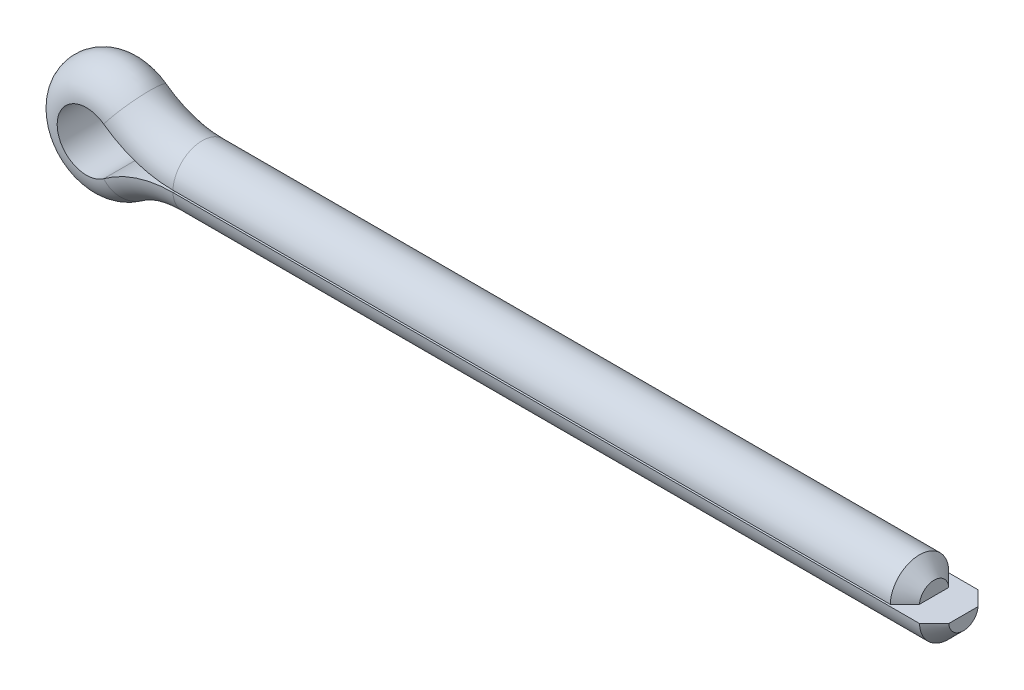
ISO-10303-21;
HEADER;
FILE_DESCRIPTION(('STEP AP214'),'2;1');
FILE_NAME('part.step','',(''),(''),'','','');
FILE_SCHEMA(('AUTOMOTIVE_DESIGN { 1 0 10303 214 1 1 1 1 }'));
ENDSEC;
DATA;
#1=APPLICATION_CONTEXT('core data for automotive mechanical design processes');
#2=APPLICATION_PROTOCOL_DEFINITION('international standard','automotive_design',2000,#1);
#3=PRODUCT_CONTEXT('',#1,'mechanical');
#4=PRODUCT('Part','Part','',(#3));
#5=PRODUCT_RELATED_PRODUCT_CATEGORY('part','',(#4));
#6=PRODUCT_DEFINITION_FORMATION('','',#4);
#7=PRODUCT_DEFINITION_CONTEXT('part definition',#1,'design');
#8=PRODUCT_DEFINITION('design','',#6,#7);
#9=PRODUCT_DEFINITION_SHAPE('','',#8);
#10=(LENGTH_UNIT() NAMED_UNIT(*) SI_UNIT(.MILLI.,.METRE.));
#11=(NAMED_UNIT(*) PLANE_ANGLE_UNIT() SI_UNIT($,.RADIAN.));
#12=(NAMED_UNIT(*) SI_UNIT($,.STERADIAN.) SOLID_ANGLE_UNIT());
#13=UNCERTAINTY_MEASURE_WITH_UNIT(LENGTH_MEASURE(1.E-05),#10,'distance_accuracy_value','');
#14=(GEOMETRIC_REPRESENTATION_CONTEXT(3) GLOBAL_UNCERTAINTY_ASSIGNED_CONTEXT((#13)) GLOBAL_UNIT_ASSIGNED_CONTEXT((#10,
#11,#12)) REPRESENTATION_CONTEXT('',''));
#15=CARTESIAN_POINT('',(0.,0.,0.));
#16=DIRECTION('',(0.,0.,1.));
#17=DIRECTION('',(1.,0.,0.));
#18=AXIS2_PLACEMENT_3D('',#15,#16,#17);
#19=CARTESIAN_POINT('',(0.761999999999999,0.,0.));
#20=DIRECTION('',(-1.,0.,0.));
#21=DIRECTION('',(0.,0.,-1.));
#22=AXIS2_PLACEMENT_3D('',#19,#20,#21);
#23=PLANE('',#22);
#24=DIRECTION('',(0.,0.,-1.));
#25=VECTOR('',#24,1.);
#26=CARTESIAN_POINT('',(0.761999999999999,-0.0254,0.761576549008699));
#27=LINE('',#26,#25);
#28=CARTESIAN_POINT('',(0.761999999999999,-0.0254,0.380152390496232));
#29=VERTEX_POINT('',#28);
#30=CARTESIAN_POINT('',(0.761999999999999,-0.0253999999999999,-0.380152390496232));
#31=VERTEX_POINT('',#30);
#32=EDGE_CURVE('E149',#29,#31,#27,.T.);
#33=ORIENTED_EDGE('',*,*,#32,.F.);
#34=CARTESIAN_POINT('',(0.761999999999999,0.,0.));
#35=DIRECTION('',(-1.,0.,0.));
#36=DIRECTION('',(0.,-1.,0.));
#37=AXIS2_PLACEMENT_3D('',#34,#35,#36);
#38=CIRCLE('',#37,0.380999999999999);
#39=EDGE_CURVE('E284',#29,#31,#38,.F.);
#40=ORIENTED_EDGE('',*,*,#39,.T.);
#41=EDGE_LOOP('',(#33,#40));
#42=FACE_BOUND('',#41,.T.);
#43=ADVANCED_FACE('F69',(#42),#23,.F.);
#44=CARTESIAN_POINT('',(0.,0.,0.));
#45=DIRECTION('',(1.,0.,0.));
#46=DIRECTION('',(0.,0.,-1.));
#47=AXIS2_PLACEMENT_3D('',#44,#45,#46);
#48=PLANE('',#47);
#49=DIRECTION('',(0.,0.,-1.));
#50=VECTOR('',#49,1.);
#51=CARTESIAN_POINT('',(0.,0.0254,0.761576549008699));
#52=LINE('',#51,#50);
#53=CARTESIAN_POINT('',(0.,0.0254,0.380152390496232));
#54=VERTEX_POINT('',#53);
#55=CARTESIAN_POINT('',(0.,0.0253999999999999,-0.380152390496232));
#56=VERTEX_POINT('',#55);
#57=EDGE_CURVE('E209',#54,#56,#52,.T.);
#58=ORIENTED_EDGE('',*,*,#57,.T.);
#59=CARTESIAN_POINT('',(0.,0.,0.));
#60=DIRECTION('',(1.,0.,0.));
#61=DIRECTION('',(0.,0.,-1.));
#62=AXIS2_PLACEMENT_3D('',#59,#60,#61);
#63=CIRCLE('',#62,0.380999999999999);
#64=EDGE_CURVE('E280',#56,#54,#63,.T.);
#65=ORIENTED_EDGE('',*,*,#64,.T.);
#66=EDGE_LOOP('',(#58,#65));
#67=FACE_BOUND('',#66,.T.);
#68=ADVANCED_FACE('F255',(#67),#48,.T.);
#69=CARTESIAN_POINT('',(0.761999999999999,0.,0.));
#70=DIRECTION('',(-1.,0.,0.));
#71=DIRECTION('',(0.,-1.,0.));
#72=AXIS2_PLACEMENT_3D('',#69,#70,#71);
#73=CYLINDRICAL_SURFACE('',#72,0.761999999999999);
#74=DIRECTION('',(-1.,0.,0.));
#75=VECTOR('',#74,1.);
#76=CARTESIAN_POINT('',(0.761999999999999,-0.0253999999999999,-0.761576549008699));
#77=LINE('',#76,#75);
#78=CARTESIAN_POINT('',(0.381000000000002,-0.0253999999999998,-0.761576549008699));
#79=VERTEX_POINT('',#78);
#80=CARTESIAN_POINT('',(-19.05,-0.0253999999999973,-0.761576549008699));
#81=VERTEX_POINT('',#80);
#82=EDGE_CURVE('E133',#79,#81,#77,.T.);
#83=ORIENTED_EDGE('',*,*,#82,.F.);
#84=CARTESIAN_POINT('',(0.381000000000002,0.,0.));
#85=DIRECTION('',(-1.,0.,0.));
#86=DIRECTION('',(0.,-1.,0.));
#87=AXIS2_PLACEMENT_3D('',#84,#85,#86);
#88=CIRCLE('',#87,0.761999999999999);
#89=CARTESIAN_POINT('',(0.381000000000002,-0.0254,0.761576549008699));
#90=VERTEX_POINT('',#89);
#91=EDGE_CURVE('E227',#79,#90,#88,.T.);
#92=ORIENTED_EDGE('',*,*,#91,.T.);
#93=DIRECTION('',(-1.,0.,0.));
#94=VECTOR('',#93,1.);
#95=CARTESIAN_POINT('',(0.761999999999999,-0.0254,0.761576549008699));
#96=LINE('',#95,#94);
#97=CARTESIAN_POINT('',(-19.05,-0.0253999999999975,0.761576549008699));
#98=VERTEX_POINT('',#97);
#99=EDGE_CURVE('E167',#90,#98,#96,.T.);
#100=ORIENTED_EDGE('',*,*,#99,.T.);
#101=CARTESIAN_POINT('',(-19.05,0.,0.));
#102=DIRECTION('',(-1.,0.,0.));
#103=DIRECTION('',(0.,0.,-1.));
#104=AXIS2_PLACEMENT_3D('',#101,#102,#103);
#105=CIRCLE('',#104,0.761999999999999);
#106=EDGE_CURVE('E148',#81,#98,#105,.T.);
#107=ORIENTED_EDGE('',*,*,#106,.F.);
#108=EDGE_LOOP('',(#83,#92,#100,#107));
#109=FACE_BOUND('',#108,.T.);
#110=ADVANCED_FACE('F169',(#109),#73,.T.);
#111=CARTESIAN_POINT('',(0.761999999999999,-0.0254,0.761576549008699));
#112=DIRECTION('',(0.,1.,0.));
#113=DIRECTION('',(-1.,0.,0.));
#114=AXIS2_PLACEMENT_3D('',#111,#112,#113);
#115=PLANE('',#114);
#116=ORIENTED_EDGE('',*,*,#99,.F.);
#117=CARTESIAN_POINT('',(0.381000000000002,-0.0254,0.761576549008699));
#118=CARTESIAN_POINT('',(0.444523602983847,-0.0254,0.698029434118925));
#119=CARTESIAN_POINT('',(0.508035404111098,-0.0254,0.634470530496681));
#120=CARTESIAN_POINT('',(0.63503540411164,-0.0254,0.507329144326401));
#121=CARTESIAN_POINT('',(0.698523602984388,-0.0254,0.443746661777822));
#122=CARTESIAN_POINT('',(0.761999999999999,-0.0254,0.380152390496232));
#123=B_SPLINE_CURVE_WITH_KNOTS('',3,(#117,#118,#119,#120,#121,#122),.UNSPECIFIED.,.F.,.F.,(4,2,
4),(0.,0.269557689574612,0.539115385343649),.UNSPECIFIED.);
#124=EDGE_CURVE('E237',#90,#29,#123,.T.);
#125=ORIENTED_EDGE('',*,*,#124,.T.);
#126=ORIENTED_EDGE('',*,*,#32,.T.);
#127=CARTESIAN_POINT('',(0.761999999999999,-0.0253999999999999,-0.380152390496232));
#128=CARTESIAN_POINT('',(0.656880354086052,-0.0253999999999999,-0.485453197874022));
#129=CARTESIAN_POINT('',(0.55173416036815,-0.0253999999999998,-0.590727481670878));
#130=CARTESIAN_POINT('',(0.424708758686162,-0.0253999999999998,-0.717843489336977));
#131=CARTESIAN_POINT('',(0.402854952404066,-0.0253999999999998,-0.739710591710943));
#132=CARTESIAN_POINT('',(0.381000000000003,-0.0253999999999998,-0.7615765490087));
#133=B_SPLINE_CURVE_WITH_KNOTS('',3,(#127,#128,#129,#130,#131,#132),.UNSPECIFIED.,.F.,.F.,(4,2,
4),(0.,0.446369322356199,0.539115379616012),.UNSPECIFIED.);
#134=EDGE_CURVE('E142',#31,#79,#133,.T.);
#135=ORIENTED_EDGE('',*,*,#134,.T.);
#136=ORIENTED_EDGE('',*,*,#82,.T.);
#137=DIRECTION('',(0.,0.,-1.));
#138=VECTOR('',#137,1.);
#139=CARTESIAN_POINT('',(-19.05,-0.0253999999999975,0.761576549008699));
#140=LINE('',#139,#138);
#141=EDGE_CURVE('E138',#98,#81,#140,.T.);
#142=ORIENTED_EDGE('',*,*,#141,.F.);
#143=EDGE_LOOP('',(#116,#125,#126,#135,#136,#142));
#144=FACE_BOUND('',#143,.T.);
#145=ADVANCED_FACE('F136',(#144),#115,.T.);
#146=CARTESIAN_POINT('',(-19.05,-3.0734,0.));
#147=DIRECTION('',(0.,0.,1.));
#148=DIRECTION('',(1.,0.,0.));
#149=AXIS2_PLACEMENT_3D('',#146,#147,#148);
#150=TOROIDAL_SURFACE('',#149,3.0734,0.761999999999999);
#151=CARTESIAN_POINT('',(-19.05,-3.0734,0.761576549008699));
#152=DIRECTION('',(0.,0.,1.));
#153=DIRECTION('',(0.,1.,0.));
#154=AXIS2_PLACEMENT_3D('',#151,#152,#153);
#155=CIRCLE('',#154,3.048);
#156=CARTESIAN_POINT('',(-20.8513883428067,-0.614680000000001,0.761576549008699));
#157=VERTEX_POINT('',#156);
#158=EDGE_CURVE('E165',#98,#157,#155,.T.);
#159=ORIENTED_EDGE('',*,*,#158,.T.);
#160=CARTESIAN_POINT('',(-20.8663999123301,-0.594190666666668,0.));
#161=DIRECTION('',(-0.806666666666665,-0.591006674149194,0.));
#162=DIRECTION('',(0.,0.,-1.));
#163=AXIS2_PLACEMENT_3D('',#160,#161,#162);
#164=CIRCLE('',#163,0.761999999999999);
#165=CARTESIAN_POINT('',(-20.8513883428067,-0.614680000000001,-0.761576549008699));
#166=VERTEX_POINT('',#165);
#167=EDGE_CURVE('E158',#166,#157,#164,.T.);
#168=ORIENTED_EDGE('',*,*,#167,.F.);
#169=CARTESIAN_POINT('',(-19.05,-3.0734,-0.761576549008699));
#170=DIRECTION('',(0.,0.,1.));
#171=DIRECTION('',(0.,1.,0.));
#172=AXIS2_PLACEMENT_3D('',#169,#170,#171);
#173=CIRCLE('',#172,3.048);
#174=EDGE_CURVE('E154',#81,#166,#173,.T.);
#175=ORIENTED_EDGE('',*,*,#174,.F.);
#176=ORIENTED_EDGE('',*,*,#106,.T.);
#177=EDGE_LOOP('',(#159,#168,#175,#176));
#178=FACE_BOUND('',#177,.T.);
#179=ADVANCED_FACE('F156',(#178),#150,.T.);
#180=CARTESIAN_POINT('',(-19.05,-3.0734,0.));
#181=DIRECTION('',(0.,0.,1.));
#182=DIRECTION('',(1.,0.,0.));
#183=AXIS2_PLACEMENT_3D('',#180,#181,#182);
#184=CYLINDRICAL_SURFACE('',#183,3.048);
#185=DIRECTION('',(0.,0.,-1.));
#186=VECTOR('',#185,1.);
#187=CARTESIAN_POINT('',(-20.8513883428067,-0.614680000000001,0.761576549008699));
#188=LINE('',#187,#186);
#189=EDGE_CURVE('E178',#157,#166,#188,.T.);
#190=ORIENTED_EDGE('',*,*,#189,.F.);
#191=ORIENTED_EDGE('',*,*,#158,.F.);
#192=ORIENTED_EDGE('',*,*,#141,.T.);
#193=ORIENTED_EDGE('',*,*,#174,.T.);
#194=EDGE_LOOP('',(#190,#191,#192,#193));
#195=FACE_BOUND('',#194,.T.);
#196=ADVANCED_FACE('F164',(#195),#184,.T.);
#197=CARTESIAN_POINT('',(-21.3017354285084,0.,0.));
#198=DIRECTION('',(0.,0.,-1.));
#199=DIRECTION('',(-1.,0.,0.));
#200=AXIS2_PLACEMENT_3D('',#197,#198,#199);
#201=DEGENERATE_TOROIDAL_SURFACE('',#200,0.736600000000001,0.761999999999999,.T.);
#202=CARTESIAN_POINT('',(-21.3017354285084,0.,0.761576549008699));
#203=DIRECTION('',(0.,0.,-1.));
#204=DIRECTION('',(0.591006674149193,-0.806666666666666,0.));
#205=AXIS2_PLACEMENT_3D('',#202,#203,#204);
#206=CIRCLE('',#205,0.762000000000001);
#207=CARTESIAN_POINT('',(-20.8513883428067,0.61468,0.761576549008699));
#208=VERTEX_POINT('',#207);
#209=EDGE_CURVE('E184',#157,#208,#206,.T.);
#210=ORIENTED_EDGE('',*,*,#209,.T.);
#211=CARTESIAN_POINT('',(-20.8663999123301,0.594190666666666,0.));
#212=DIRECTION('',(0.806666666666666,-0.591006674149193,0.));
#213=DIRECTION('',(0.,0.,-1.));
#214=AXIS2_PLACEMENT_3D('',#211,#212,#213);
#215=CIRCLE('',#214,0.761999999999999);
#216=CARTESIAN_POINT('',(-20.8513883428067,0.61468,-0.761576549008699));
#217=VERTEX_POINT('',#216);
#218=EDGE_CURVE('E180',#217,#208,#215,.T.);
#219=ORIENTED_EDGE('',*,*,#218,.F.);
#220=CARTESIAN_POINT('',(-21.3017354285084,0.,-0.761576549008699));
#221=DIRECTION('',(0.,0.,-1.));
#222=DIRECTION('',(0.591006674149193,-0.806666666666666,0.));
#223=AXIS2_PLACEMENT_3D('',#220,#221,#222);
#224=CIRCLE('',#223,0.762000000000001);
#225=EDGE_CURVE('E185',#166,#217,#224,.T.);
#226=ORIENTED_EDGE('',*,*,#225,.F.);
#227=ORIENTED_EDGE('',*,*,#167,.T.);
#228=EDGE_LOOP('',(#210,#219,#226,#227));
#229=FACE_BOUND('',#228,.T.);
#230=ADVANCED_FACE('F348',(#229),#201,.T.);
#231=CARTESIAN_POINT('',(-21.3017354285084,0.,0.));
#232=DIRECTION('',(0.,0.,-1.));
#233=DIRECTION('',(-1.,0.,0.));
#234=AXIS2_PLACEMENT_3D('',#231,#232,#233);
#235=CYLINDRICAL_SURFACE('',#234,0.762000000000001);
#236=DIRECTION('',(0.,0.,-1.));
#237=VECTOR('',#236,1.);
#238=CARTESIAN_POINT('',(-20.8513883428067,0.61468,0.761576549008699));
#239=LINE('',#238,#237);
#240=EDGE_CURVE('E189',#208,#217,#239,.T.);
#241=ORIENTED_EDGE('',*,*,#240,.F.);
#242=ORIENTED_EDGE('',*,*,#209,.F.);
#243=ORIENTED_EDGE('',*,*,#189,.T.);
#244=ORIENTED_EDGE('',*,*,#225,.T.);
#245=EDGE_LOOP('',(#241,#242,#243,#244));
#246=FACE_BOUND('',#245,.T.);
#247=ADVANCED_FACE('F340',(#246),#235,.F.);
#248=CARTESIAN_POINT('',(-19.05,3.0734,0.));
#249=DIRECTION('',(0.,0.,1.));
#250=DIRECTION('',(1.,0.,0.));
#251=AXIS2_PLACEMENT_3D('',#248,#249,#250);
#252=TOROIDAL_SURFACE('',#251,3.07339999999999,0.761999999999999);
#253=CARTESIAN_POINT('',(-19.05,3.0734,0.761576549008699));
#254=DIRECTION('',(0.,0.,1.));
#255=DIRECTION('',(-0.59100667414919,-0.806666666666668,0.));
#256=AXIS2_PLACEMENT_3D('',#253,#254,#255);
#257=CIRCLE('',#256,3.04799999999999);
#258=CARTESIAN_POINT('',(-19.05,0.0254000000000035,0.761576549008699));
#259=VERTEX_POINT('',#258);
#260=EDGE_CURVE('E197',#208,#259,#257,.T.);
#261=ORIENTED_EDGE('',*,*,#260,.T.);
#262=CARTESIAN_POINT('',(-19.05,0.,0.));
#263=DIRECTION('',(1.,0.,0.));
#264=DIRECTION('',(0.,0.,-1.));
#265=AXIS2_PLACEMENT_3D('',#262,#263,#264);
#266=CIRCLE('',#265,0.761999999999999);
#267=CARTESIAN_POINT('',(-19.05,0.0254000000000035,-0.761576549008699));
#268=VERTEX_POINT('',#267);
#269=EDGE_CURVE('E193',#268,#259,#266,.T.);
#270=ORIENTED_EDGE('',*,*,#269,.F.);
#271=CARTESIAN_POINT('',(-19.05,3.0734,-0.761576549008699));
#272=DIRECTION('',(0.,0.,1.));
#273=DIRECTION('',(-0.59100667414919,-0.806666666666668,0.));
#274=AXIS2_PLACEMENT_3D('',#271,#272,#273);
#275=CIRCLE('',#274,3.04799999999999);
#276=EDGE_CURVE('E198',#217,#268,#275,.T.);
#277=ORIENTED_EDGE('',*,*,#276,.F.);
#278=ORIENTED_EDGE('',*,*,#218,.T.);
#279=EDGE_LOOP('',(#261,#270,#277,#278));
#280=FACE_BOUND('',#279,.T.);
#281=ADVANCED_FACE('F333',(#280),#252,.T.);
#282=CARTESIAN_POINT('',(-19.05,3.0734,0.));
#283=DIRECTION('',(0.,0.,1.));
#284=DIRECTION('',(1.,0.,0.));
#285=AXIS2_PLACEMENT_3D('',#282,#283,#284);
#286=CYLINDRICAL_SURFACE('',#285,3.04799999999999);
#287=DIRECTION('',(0.,0.,-1.));
#288=VECTOR('',#287,1.);
#289=CARTESIAN_POINT('',(-19.05,0.0254000000000022,0.761576549008699));
#290=LINE('',#289,#288);
#291=EDGE_CURVE('E202',#259,#268,#290,.T.);
#292=ORIENTED_EDGE('',*,*,#291,.F.);
#293=ORIENTED_EDGE('',*,*,#260,.F.);
#294=ORIENTED_EDGE('',*,*,#240,.T.);
#295=ORIENTED_EDGE('',*,*,#276,.T.);
#296=EDGE_LOOP('',(#292,#293,#294,#295));
#297=FACE_BOUND('',#296,.T.);
#298=ADVANCED_FACE('F264',(#297),#286,.T.);
#299=CARTESIAN_POINT('',(-19.05,0.,0.));
#300=DIRECTION('',(1.,0.,0.));
#301=DIRECTION('',(0.,1.,0.));
#302=AXIS2_PLACEMENT_3D('',#299,#300,#301);
#303=CYLINDRICAL_SURFACE('',#302,0.761999999999999);
#304=DIRECTION('',(1.,0.,0.));
#305=VECTOR('',#304,1.);
#306=CARTESIAN_POINT('',(-19.05,0.0254000000000009,0.761576549008699));
#307=LINE('',#306,#305);
#308=CARTESIAN_POINT('',(-0.380999999999999,0.0254,0.761576549008699));
#309=VERTEX_POINT('',#308);
#310=EDGE_CURVE('E206',#259,#309,#307,.T.);
#311=ORIENTED_EDGE('',*,*,#310,.T.);
#312=CARTESIAN_POINT('',(-0.380999999999999,0.,0.));
#313=DIRECTION('',(1.,0.,0.));
#314=DIRECTION('',(0.,1.,0.));
#315=AXIS2_PLACEMENT_3D('',#312,#313,#314);
#316=CIRCLE('',#315,0.761999999999999);
#317=CARTESIAN_POINT('',(-0.380999999999999,0.0253999999999999,-0.761576549008699));
#318=VERTEX_POINT('',#317);
#319=EDGE_CURVE('E12',#309,#318,#316,.F.);
#320=ORIENTED_EDGE('',*,*,#319,.T.);
#321=DIRECTION('',(1.,0.,0.));
#322=VECTOR('',#321,1.);
#323=CARTESIAN_POINT('',(-19.05,0.0254000000000008,-0.761576549008699));
#324=LINE('',#323,#322);
#325=EDGE_CURVE('E210',#268,#318,#324,.T.);
#326=ORIENTED_EDGE('',*,*,#325,.F.);
#327=ORIENTED_EDGE('',*,*,#269,.T.);
#328=EDGE_LOOP('',(#311,#320,#326,#327));
#329=FACE_BOUND('',#328,.T.);
#330=ADVANCED_FACE('F263',(#329),#303,.T.);
#331=CARTESIAN_POINT('',(-19.05,0.0254000000000009,0.761576549008699));
#332=DIRECTION('',(0.,-1.,0.));
#333=DIRECTION('',(0.,0.,-1.));
#334=AXIS2_PLACEMENT_3D('',#331,#332,#333);
#335=PLANE('',#334);
#336=ORIENTED_EDGE('',*,*,#57,.F.);
#337=CARTESIAN_POINT('',(0.,0.0254,0.380152390496232));
#338=CARTESIAN_POINT('',(-0.105119645913947,0.0254,0.485453197874022));
#339=CARTESIAN_POINT('',(-0.21026583963185,0.0254,0.590727481670877));
#340=CARTESIAN_POINT('',(-0.337291241313838,0.0254,0.717843489336976));
#341=CARTESIAN_POINT('',(-0.359145047595935,0.0254,0.739710591710943));
#342=CARTESIAN_POINT('',(-0.380999999999998,0.0254,0.7615765490087));
#343=B_SPLINE_CURVE_WITH_KNOTS('',3,(#337,#338,#339,#340,#341,#342),.UNSPECIFIED.,.F.,.F.,(4,2,
4),(0.,0.4463693223562,0.539115379616013),.UNSPECIFIED.);
#344=EDGE_CURVE('E79',#54,#309,#343,.T.);
#345=ORIENTED_EDGE('',*,*,#344,.T.);
#346=ORIENTED_EDGE('',*,*,#310,.F.);
#347=ORIENTED_EDGE('',*,*,#291,.T.);
#348=ORIENTED_EDGE('',*,*,#325,.T.);
#349=CARTESIAN_POINT('',(-0.380999999999999,0.0253999999999999,-0.761576549008699));
#350=CARTESIAN_POINT('',(-0.317476397016154,0.0253999999999999,-0.698029434118925));
#351=CARTESIAN_POINT('',(-0.253964595888902,0.0253999999999999,-0.634470530496681));
#352=CARTESIAN_POINT('',(-0.12696459588836,0.0253999999999999,-0.507329144326401));
#353=CARTESIAN_POINT('',(-0.0634763970156115,0.0253999999999999,-0.443746661777822));
#354=CARTESIAN_POINT('',(0.,0.0253999999999999,-0.380152390496232));
#355=B_SPLINE_CURVE_WITH_KNOTS('',3,(#349,#350,#351,#352,#353,#354),.UNSPECIFIED.,.F.,.F.,(4,2,
4),(0.,0.269557689574613,0.53911538534365),.UNSPECIFIED.);
#356=EDGE_CURVE('E268',#318,#56,#355,.T.);
#357=ORIENTED_EDGE('',*,*,#356,.T.);
#358=EDGE_LOOP('',(#336,#345,#346,#347,#348,#357));
#359=FACE_BOUND('',#358,.T.);
#360=ADVANCED_FACE('F250',(#359),#335,.T.);
#361=CARTESIAN_POINT('',(0.381000000000002,0.,0.));
#362=DIRECTION('',(-1.,0.,0.));
#363=DIRECTION('',(0.,-1.,0.));
#364=AXIS2_PLACEMENT_3D('',#361,#362,#363);
#365=CONICAL_SURFACE('',#364,0.761999999999999,0.785398163397452);
#366=ORIENTED_EDGE('',*,*,#134,.F.);
#367=ORIENTED_EDGE('',*,*,#39,.F.);
#368=ORIENTED_EDGE('',*,*,#124,.F.);
#369=ORIENTED_EDGE('',*,*,#91,.F.);
#370=EDGE_LOOP('',(#366,#367,#368,#369));
#371=FACE_BOUND('',#370,.T.);
#372=ADVANCED_FACE('F246',(#371),#365,.T.);
#373=CARTESIAN_POINT('',(0.,0.,0.));
#374=DIRECTION('',(-1.,0.,0.));
#375=DIRECTION('',(0.,-1.,0.));
#376=AXIS2_PLACEMENT_3D('',#373,#374,#375);
#377=CONICAL_SURFACE('',#376,0.380999999999999,0.785398163397449);
#378=ORIENTED_EDGE('',*,*,#356,.F.);
#379=ORIENTED_EDGE('',*,*,#319,.F.);
#380=ORIENTED_EDGE('',*,*,#344,.F.);
#381=ORIENTED_EDGE('',*,*,#64,.F.);
#382=EDGE_LOOP('',(#378,#379,#380,#381));
#383=FACE_BOUND('',#382,.T.);
#384=ADVANCED_FACE('F71',(#383),#377,.T.);
#385=CLOSED_SHELL('',(#43,#68,#110,#145,#179,#196,#230,#247,#281,#298,#330,#360,#372,#384));
#386=MANIFOLD_SOLID_BREP('B2',#385);
#387=ADVANCED_BREP_SHAPE_REPRESENTATION('',(#18,#386),#14);
#388=SHAPE_DEFINITION_REPRESENTATION(#9,#387);
ENDSEC;
END-ISO-10303-21;
